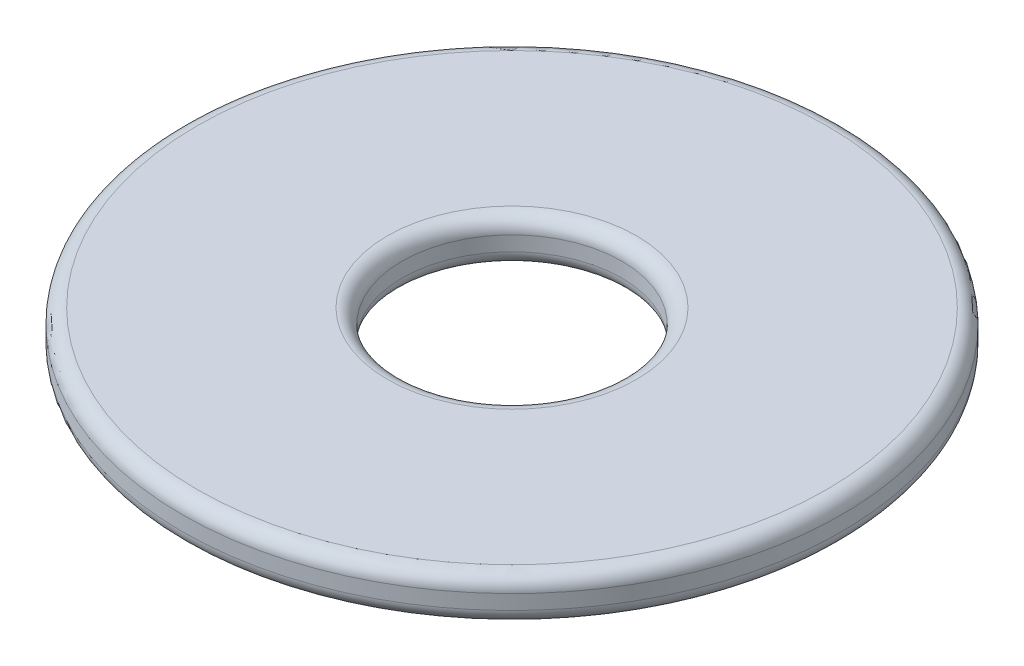
ISO-10303-21;
HEADER;
FILE_DESCRIPTION(('STEP AP214'),'2;1');
FILE_NAME('part.step','',(''),(''),'','','');
FILE_SCHEMA(('AUTOMOTIVE_DESIGN { 1 0 10303 214 1 1 1 1 }'));
ENDSEC;
DATA;
#1=APPLICATION_CONTEXT('core data for automotive mechanical design processes');
#2=APPLICATION_PROTOCOL_DEFINITION('international standard','automotive_design',2000,#1);
#3=PRODUCT_CONTEXT('',#1,'mechanical');
#4=PRODUCT('Part','Part','',(#3));
#5=PRODUCT_RELATED_PRODUCT_CATEGORY('part','',(#4));
#6=PRODUCT_DEFINITION_FORMATION('','',#4);
#7=PRODUCT_DEFINITION_CONTEXT('part definition',#1,'design');
#8=PRODUCT_DEFINITION('design','',#6,#7);
#9=PRODUCT_DEFINITION_SHAPE('','',#8);
#10=(LENGTH_UNIT() NAMED_UNIT(*) SI_UNIT(.MILLI.,.METRE.));
#11=(NAMED_UNIT(*) PLANE_ANGLE_UNIT() SI_UNIT($,.RADIAN.));
#12=(NAMED_UNIT(*) SI_UNIT($,.STERADIAN.) SOLID_ANGLE_UNIT());
#13=UNCERTAINTY_MEASURE_WITH_UNIT(LENGTH_MEASURE(1.E-05),#10,'distance_accuracy_value','');
#14=(GEOMETRIC_REPRESENTATION_CONTEXT(3) GLOBAL_UNCERTAINTY_ASSIGNED_CONTEXT((#13)) GLOBAL_UNIT_ASSIGNED_CONTEXT((#10,
#11,#12)) REPRESENTATION_CONTEXT('',''));
#15=CARTESIAN_POINT('',(0.,0.,0.));
#16=DIRECTION('',(0.,0.,1.));
#17=DIRECTION('',(1.,0.,0.));
#18=AXIS2_PLACEMENT_3D('',#15,#16,#17);
#19=CARTESIAN_POINT('',(0.,1.2,0.));
#20=DIRECTION('',(0.,1.,0.));
#21=DIRECTION('',(0.,0.,1.));
#22=AXIS2_PLACEMENT_3D('',#19,#20,#21);
#23=PLANE('',#22);
#24=CARTESIAN_POINT('',(0.,1.2,0.));
#25=DIRECTION('',(0.,1.,0.));
#26=DIRECTION('',(0.,0.,1.));
#27=AXIS2_PLACEMENT_3D('',#24,#25,#26);
#28=CIRCLE('',#27,3.4);
#29=CARTESIAN_POINT('',(0.,1.2,3.4));
#30=VERTEX_POINT('',#29);
#31=EDGE_CURVE('E50',#30,#30,#28,.F.);
#32=ORIENTED_EDGE('',*,*,#31,.T.);
#33=EDGE_LOOP('',(#32));
#34=FACE_BOUND('',#33,.T.);
#35=CARTESIAN_POINT('',(0.,1.2,0.));
#36=DIRECTION('',(0.,1.,0.));
#37=DIRECTION('',(0.,0.,1.));
#38=AXIS2_PLACEMENT_3D('',#35,#36,#37);
#39=CIRCLE('',#38,8.6);
#40=CARTESIAN_POINT('',(0.,1.2,8.6));
#41=VERTEX_POINT('',#40);
#42=EDGE_CURVE('E55',#41,#41,#39,.T.);
#43=ORIENTED_EDGE('',*,*,#42,.T.);
#44=EDGE_LOOP('',(#43));
#45=FACE_BOUND('',#44,.T.);
#46=ADVANCED_FACE('F37',(#34,#45),#23,.T.);
#47=CARTESIAN_POINT('',(0.,0.,0.));
#48=DIRECTION('',(0.,1.,0.));
#49=DIRECTION('',(0.,0.,1.));
#50=AXIS2_PLACEMENT_3D('',#47,#48,#49);
#51=PLANE('',#50);
#52=CARTESIAN_POINT('',(0.,0.,0.));
#53=DIRECTION('',(0.,1.,0.));
#54=DIRECTION('',(0.,0.,1.));
#55=AXIS2_PLACEMENT_3D('',#52,#53,#54);
#56=CIRCLE('',#55,3.4);
#57=CARTESIAN_POINT('',(0.,0.,3.4));
#58=VERTEX_POINT('',#57);
#59=EDGE_CURVE('E69',#58,#58,#56,.T.);
#60=ORIENTED_EDGE('',*,*,#59,.T.);
#61=EDGE_LOOP('',(#60));
#62=FACE_BOUND('',#61,.T.);
#63=CARTESIAN_POINT('',(0.,0.,0.));
#64=DIRECTION('',(0.,1.,0.));
#65=DIRECTION('',(0.,0.,1.));
#66=AXIS2_PLACEMENT_3D('',#63,#64,#65);
#67=CIRCLE('',#66,8.6);
#68=CARTESIAN_POINT('',(0.,0.,8.6));
#69=VERTEX_POINT('',#68);
#70=EDGE_CURVE('E73',#69,#69,#67,.F.);
#71=ORIENTED_EDGE('',*,*,#70,.T.);
#72=EDGE_LOOP('',(#71));
#73=FACE_BOUND('',#72,.T.);
#74=ADVANCED_FACE('F78',(#62,#73),#51,.F.);
#75=CARTESIAN_POINT('',(0.,1.2,0.));
#76=DIRECTION('',(0.,-1.,0.));
#77=DIRECTION('',(0.,0.,-1.));
#78=AXIS2_PLACEMENT_3D('',#75,#76,#77);
#79=CYLINDRICAL_SURFACE('',#78,9.);
#80=CARTESIAN_POINT('',(0.,0.4,0.));
#81=DIRECTION('',(0.,1.,0.));
#82=DIRECTION('',(0.,0.,1.));
#83=AXIS2_PLACEMENT_3D('',#80,#81,#82);
#84=CIRCLE('',#83,9.);
#85=CARTESIAN_POINT('',(0.,0.4,9.));
#86=VERTEX_POINT('',#85);
#87=EDGE_CURVE('E10',#86,#86,#84,.T.);
#88=ORIENTED_EDGE('',*,*,#87,.T.);
#89=EDGE_LOOP('',(#88));
#90=FACE_BOUND('',#89,.T.);
#91=CARTESIAN_POINT('',(0.,0.8,0.));
#92=DIRECTION('',(0.,1.,0.));
#93=DIRECTION('',(0.,0.,1.));
#94=AXIS2_PLACEMENT_3D('',#91,#92,#93);
#95=CIRCLE('',#94,9.);
#96=CARTESIAN_POINT('',(0.,0.8,9.));
#97=VERTEX_POINT('',#96);
#98=EDGE_CURVE('E45',#97,#97,#95,.F.);
#99=ORIENTED_EDGE('',*,*,#98,.T.);
#100=EDGE_LOOP('',(#99));
#101=FACE_BOUND('',#100,.T.);
#102=ADVANCED_FACE('F98',(#90,#101),#79,.T.);
#103=CARTESIAN_POINT('',(0.,1.2,0.));
#104=DIRECTION('',(0.,-1.,0.));
#105=DIRECTION('',(0.,0.,-1.));
#106=AXIS2_PLACEMENT_3D('',#103,#104,#105);
#107=CYLINDRICAL_SURFACE('',#106,3.);
#108=CARTESIAN_POINT('',(0.,0.4,0.));
#109=DIRECTION('',(0.,1.,0.));
#110=DIRECTION('',(0.,0.,1.));
#111=AXIS2_PLACEMENT_3D('',#108,#109,#110);
#112=CIRCLE('',#111,3.);
#113=CARTESIAN_POINT('',(0.,0.4,3.));
#114=VERTEX_POINT('',#113);
#115=EDGE_CURVE('E61',#114,#114,#112,.F.);
#116=ORIENTED_EDGE('',*,*,#115,.T.);
#117=EDGE_LOOP('',(#116));
#118=FACE_BOUND('',#117,.T.);
#119=CARTESIAN_POINT('',(0.,0.8,0.));
#120=DIRECTION('',(0.,1.,0.));
#121=DIRECTION('',(0.,0.,1.));
#122=AXIS2_PLACEMENT_3D('',#119,#120,#121);
#123=CIRCLE('',#122,3.);
#124=CARTESIAN_POINT('',(0.,0.8,3.));
#125=VERTEX_POINT('',#124);
#126=EDGE_CURVE('E65',#125,#125,#123,.T.);
#127=ORIENTED_EDGE('',*,*,#126,.T.);
#128=EDGE_LOOP('',(#127));
#129=FACE_BOUND('',#128,.T.);
#130=ADVANCED_FACE('F103',(#118,#129),#107,.F.);
#131=CARTESIAN_POINT('',(0.,0.4,0.));
#132=DIRECTION('',(0.,1.,0.));
#133=DIRECTION('',(0.,0.,1.));
#134=AXIS2_PLACEMENT_3D('',#131,#132,#133);
#135=TOROIDAL_SURFACE('',#134,3.4,0.4);
#136=ORIENTED_EDGE('',*,*,#115,.F.);
#137=EDGE_LOOP('',(#136));
#138=FACE_BOUND('',#137,.T.);
#139=ORIENTED_EDGE('',*,*,#59,.F.);
#140=EDGE_LOOP('',(#139));
#141=FACE_BOUND('',#140,.T.);
#142=ADVANCED_FACE('F89',(#138,#141),#135,.T.);
#143=CARTESIAN_POINT('',(0.,0.8,0.));
#144=DIRECTION('',(0.,1.,0.));
#145=DIRECTION('',(0.,0.,1.));
#146=AXIS2_PLACEMENT_3D('',#143,#144,#145);
#147=TOROIDAL_SURFACE('',#146,3.4,0.4);
#148=ORIENTED_EDGE('',*,*,#31,.F.);
#149=EDGE_LOOP('',(#148));
#150=FACE_BOUND('',#149,.T.);
#151=ORIENTED_EDGE('',*,*,#126,.F.);
#152=EDGE_LOOP('',(#151));
#153=FACE_BOUND('',#152,.T.);
#154=ADVANCED_FACE('F83',(#150,#153),#147,.T.);
#155=CARTESIAN_POINT('',(0.,0.4,0.));
#156=DIRECTION('',(0.,1.,0.));
#157=DIRECTION('',(0.,0.,1.));
#158=AXIS2_PLACEMENT_3D('',#155,#156,#157);
#159=TOROIDAL_SURFACE('',#158,8.6,0.4);
#160=ORIENTED_EDGE('',*,*,#70,.F.);
#161=EDGE_LOOP('',(#160));
#162=FACE_BOUND('',#161,.T.);
#163=ORIENTED_EDGE('',*,*,#87,.F.);
#164=EDGE_LOOP('',(#163));
#165=FACE_BOUND('',#164,.T.);
#166=ADVANCED_FACE('F80',(#162,#165),#159,.T.);
#167=CARTESIAN_POINT('',(0.,0.8,0.));
#168=DIRECTION('',(0.,1.,0.));
#169=DIRECTION('',(0.,0.,1.));
#170=AXIS2_PLACEMENT_3D('',#167,#168,#169);
#171=TOROIDAL_SURFACE('',#170,8.6,0.4);
#172=ORIENTED_EDGE('',*,*,#98,.F.);
#173=EDGE_LOOP('',(#172));
#174=FACE_BOUND('',#173,.T.);
#175=ORIENTED_EDGE('',*,*,#42,.F.);
#176=EDGE_LOOP('',(#175));
#177=FACE_BOUND('',#176,.T.);
#178=ADVANCED_FACE('F39',(#174,#177),#171,.T.);
#179=CLOSED_SHELL('',(#46,#74,#102,#130,#142,#154,#166,#178));
#180=MANIFOLD_SOLID_BREP('B2',#179);
#181=ADVANCED_BREP_SHAPE_REPRESENTATION('',(#18,#180),#14);
#182=SHAPE_DEFINITION_REPRESENTATION(#9,#181);
ENDSEC;
END-ISO-10303-21;
